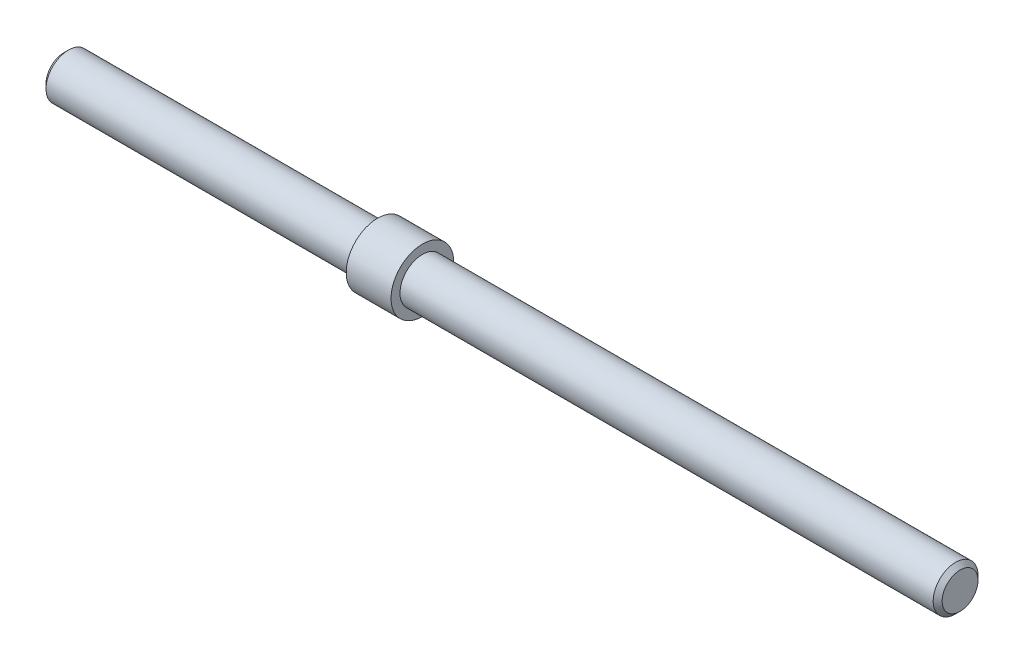
ISO-10303-21;
HEADER;
FILE_DESCRIPTION(('STEP AP214'),'2;1');
FILE_NAME('part.step','',(''),(''),'','','');
FILE_SCHEMA(('AUTOMOTIVE_DESIGN { 1 0 10303 214 1 1 1 1 }'));
ENDSEC;
DATA;
#1=APPLICATION_CONTEXT('core data for automotive mechanical design processes');
#2=APPLICATION_PROTOCOL_DEFINITION('international standard','automotive_design',2000,#1);
#3=PRODUCT_CONTEXT('',#1,'mechanical');
#4=PRODUCT('Part','Part','',(#3));
#5=PRODUCT_RELATED_PRODUCT_CATEGORY('part','',(#4));
#6=PRODUCT_DEFINITION_FORMATION('','',#4);
#7=PRODUCT_DEFINITION_CONTEXT('part definition',#1,'design');
#8=PRODUCT_DEFINITION('design','',#6,#7);
#9=PRODUCT_DEFINITION_SHAPE('','',#8);
#10=(LENGTH_UNIT() NAMED_UNIT(*) SI_UNIT(.MILLI.,.METRE.));
#11=(NAMED_UNIT(*) PLANE_ANGLE_UNIT() SI_UNIT($,.RADIAN.));
#12=(NAMED_UNIT(*) SI_UNIT($,.STERADIAN.) SOLID_ANGLE_UNIT());
#13=UNCERTAINTY_MEASURE_WITH_UNIT(LENGTH_MEASURE(1.E-05),#10,'distance_accuracy_value','');
#14=(GEOMETRIC_REPRESENTATION_CONTEXT(3) GLOBAL_UNCERTAINTY_ASSIGNED_CONTEXT((#13)) GLOBAL_UNIT_ASSIGNED_CONTEXT((#10,
#11,#12)) REPRESENTATION_CONTEXT('',''));
#15=CARTESIAN_POINT('',(0.,0.,0.));
#16=DIRECTION('',(0.,0.,1.));
#17=DIRECTION('',(1.,0.,0.));
#18=AXIS2_PLACEMENT_3D('',#15,#16,#17);
#19=CARTESIAN_POINT('',(200.,0.,0.));
#20=DIRECTION('',(-1.,0.,0.));
#21=DIRECTION('',(0.,0.,1.));
#22=AXIS2_PLACEMENT_3D('',#19,#20,#21);
#23=CYLINDRICAL_SURFACE('',#22,5.);
#24=CARTESIAN_POINT('',(80.,0.,0.));
#25=DIRECTION('',(1.,0.,0.));
#26=DIRECTION('',(0.,0.,-1.));
#27=AXIS2_PLACEMENT_3D('',#24,#25,#26);
#28=CIRCLE('',#27,5.);
#29=CARTESIAN_POINT('',(80.,0.,-5.));
#30=VERTEX_POINT('',#29);
#31=EDGE_CURVE('E42',#30,#30,#28,.T.);
#32=ORIENTED_EDGE('',*,*,#31,.T.);
#33=EDGE_LOOP('',(#32));
#34=FACE_BOUND('',#33,.T.);
#35=CARTESIAN_POINT('',(199.,0.,0.));
#36=DIRECTION('',(1.,0.,0.));
#37=DIRECTION('',(0.,0.,-1.));
#38=AXIS2_PLACEMENT_3D('',#35,#36,#37);
#39=CIRCLE('',#38,5.);
#40=CARTESIAN_POINT('',(199.,0.,-5.));
#41=VERTEX_POINT('',#40);
#42=EDGE_CURVE('E50',#41,#41,#39,.F.);
#43=ORIENTED_EDGE('',*,*,#42,.T.);
#44=EDGE_LOOP('',(#43));
#45=FACE_BOUND('',#44,.T.);
#46=ADVANCED_FACE('F37',(#34,#45),#23,.T.);
#47=CARTESIAN_POINT('',(200.,0.,0.));
#48=DIRECTION('',(1.,0.,0.));
#49=DIRECTION('',(0.,0.,-1.));
#50=AXIS2_PLACEMENT_3D('',#47,#48,#49);
#51=PLANE('',#50);
#52=CARTESIAN_POINT('',(200.,0.,0.));
#53=DIRECTION('',(1.,0.,0.));
#54=DIRECTION('',(0.,0.,-1.));
#55=AXIS2_PLACEMENT_3D('',#52,#53,#54);
#56=CIRCLE('',#55,4.);
#57=CARTESIAN_POINT('',(200.,0.,-4.));
#58=VERTEX_POINT('',#57);
#59=EDGE_CURVE('E58',#58,#58,#56,.T.);
#60=ORIENTED_EDGE('',*,*,#59,.T.);
#61=EDGE_LOOP('',(#60));
#62=FACE_BOUND('',#61,.T.);
#63=ADVANCED_FACE('F88',(#62),#51,.T.);
#64=CARTESIAN_POINT('',(200.,0.,0.));
#65=DIRECTION('',(-1.,0.,0.));
#66=DIRECTION('',(0.,0.,1.));
#67=AXIS2_PLACEMENT_3D('',#64,#65,#66);
#68=CONICAL_SURFACE('',#67,4.,0.78539816339746);
#69=ORIENTED_EDGE('',*,*,#42,.F.);
#70=EDGE_LOOP('',(#69));
#71=FACE_BOUND('',#70,.T.);
#72=ORIENTED_EDGE('',*,*,#59,.F.);
#73=EDGE_LOOP('',(#72));
#74=FACE_BOUND('',#73,.T.);
#75=ADVANCED_FACE('F84',(#71,#74),#68,.T.);
#76=CARTESIAN_POINT('',(80.,0.,0.));
#77=DIRECTION('',(-1.,0.,0.));
#78=DIRECTION('',(0.,0.,1.));
#79=AXIS2_PLACEMENT_3D('',#76,#77,#78);
#80=CYLINDRICAL_SURFACE('',#79,7.);
#81=CARTESIAN_POINT('',(80.,0.,0.));
#82=DIRECTION('',(1.,0.,0.));
#83=DIRECTION('',(0.,0.,-1.));
#84=AXIS2_PLACEMENT_3D('',#81,#82,#83);
#85=CIRCLE('',#84,7.);
#86=CARTESIAN_POINT('',(80.,0.,-7.));
#87=VERTEX_POINT('',#86);
#88=EDGE_CURVE('E64',#87,#87,#85,.T.);
#89=ORIENTED_EDGE('',*,*,#88,.F.);
#90=EDGE_LOOP('',(#89));
#91=FACE_BOUND('',#90,.T.);
#92=CARTESIAN_POINT('',(70.,0.,0.));
#93=DIRECTION('',(1.,0.,0.));
#94=DIRECTION('',(0.,0.,-1.));
#95=AXIS2_PLACEMENT_3D('',#92,#93,#94);
#96=CIRCLE('',#95,7.);
#97=CARTESIAN_POINT('',(70.,0.,-7.));
#98=VERTEX_POINT('',#97);
#99=EDGE_CURVE('E61',#98,#98,#96,.T.);
#100=ORIENTED_EDGE('',*,*,#99,.T.);
#101=EDGE_LOOP('',(#100));
#102=FACE_BOUND('',#101,.T.);
#103=ADVANCED_FACE('F76',(#91,#102),#80,.T.);
#104=CARTESIAN_POINT('',(80.,0.,0.));
#105=DIRECTION('',(1.,0.,0.));
#106=DIRECTION('',(0.,0.,-1.));
#107=AXIS2_PLACEMENT_3D('',#104,#105,#106);
#108=PLANE('',#107);
#109=ORIENTED_EDGE('',*,*,#31,.F.);
#110=EDGE_LOOP('',(#109));
#111=FACE_BOUND('',#110,.T.);
#112=ORIENTED_EDGE('',*,*,#88,.T.);
#113=EDGE_LOOP('',(#112));
#114=FACE_BOUND('',#113,.T.);
#115=ADVANCED_FACE('F73',(#111,#114),#108,.T.);
#116=CARTESIAN_POINT('',(70.,0.,0.));
#117=DIRECTION('',(1.,0.,0.));
#118=DIRECTION('',(0.,0.,-1.));
#119=AXIS2_PLACEMENT_3D('',#116,#117,#118);
#120=PLANE('',#119);
#121=CARTESIAN_POINT('',(70.,0.,0.));
#122=DIRECTION('',(1.,0.,0.));
#123=DIRECTION('',(0.,0.,-1.));
#124=AXIS2_PLACEMENT_3D('',#121,#122,#123);
#125=CIRCLE('',#124,5.);
#126=CARTESIAN_POINT('',(70.,0.,-5.));
#127=VERTEX_POINT('',#126);
#128=EDGE_CURVE('E10',#127,#127,#125,.T.);
#129=ORIENTED_EDGE('',*,*,#128,.T.);
#130=EDGE_LOOP('',(#129));
#131=FACE_BOUND('',#130,.T.);
#132=ORIENTED_EDGE('',*,*,#99,.F.);
#133=EDGE_LOOP('',(#132));
#134=FACE_BOUND('',#133,.T.);
#135=ADVANCED_FACE('F75',(#131,#134),#120,.F.);
#136=CARTESIAN_POINT('',(0.,0.,0.));
#137=DIRECTION('',(1.,0.,0.));
#138=DIRECTION('',(0.,0.,-1.));
#139=AXIS2_PLACEMENT_3D('',#136,#137,#138);
#140=PLANE('',#139);
#141=CARTESIAN_POINT('',(0.,0.,0.));
#142=DIRECTION('',(1.,0.,0.));
#143=DIRECTION('',(0.,0.,-1.));
#144=AXIS2_PLACEMENT_3D('',#141,#142,#143);
#145=CIRCLE('',#144,4.00000000000003);
#146=CARTESIAN_POINT('',(0.,0.,-4.00000000000003));
#147=VERTEX_POINT('',#146);
#148=EDGE_CURVE('E46',#147,#147,#145,.F.);
#149=ORIENTED_EDGE('',*,*,#148,.T.);
#150=EDGE_LOOP('',(#149));
#151=FACE_BOUND('',#150,.T.);
#152=ADVANCED_FACE('F82',(#151),#140,.F.);
#153=CARTESIAN_POINT('',(0.999999999999945,0.,0.));
#154=DIRECTION('',(1.,0.,0.));
#155=DIRECTION('',(0.,0.,-1.));
#156=AXIS2_PLACEMENT_3D('',#153,#154,#155);
#157=CONICAL_SURFACE('',#156,5.,0.78539816339746);
#158=ORIENTED_EDGE('',*,*,#148,.F.);
#159=EDGE_LOOP('',(#158));
#160=FACE_BOUND('',#159,.T.);
#161=CARTESIAN_POINT('',(0.999999999999945,0.,0.));
#162=DIRECTION('',(1.,0.,0.));
#163=DIRECTION('',(0.,0.,-1.));
#164=AXIS2_PLACEMENT_3D('',#161,#162,#163);
#165=CIRCLE('',#164,5.);
#166=CARTESIAN_POINT('',(0.999999999999945,0.,-5.));
#167=VERTEX_POINT('',#166);
#168=EDGE_CURVE('E55',#167,#167,#165,.T.);
#169=ORIENTED_EDGE('',*,*,#168,.F.);
#170=EDGE_LOOP('',(#169));
#171=FACE_BOUND('',#170,.T.);
#172=ADVANCED_FACE('F40',(#160,#171),#157,.T.);
#173=ORIENTED_EDGE('',*,*,#168,.T.);
#174=EDGE_LOOP('',(#173));
#175=FACE_BOUND('',#174,.T.);
#176=ORIENTED_EDGE('',*,*,#128,.F.);
#177=EDGE_LOOP('',(#176));
#178=FACE_BOUND('',#177,.T.);
#179=ADVANCED_FACE('F90',(#175,#178),#23,.T.);
#180=CLOSED_SHELL('',(#46,#63,#75,#103,#115,#135,#152,#172,#179));
#181=MANIFOLD_SOLID_BREP('B2',#180);
#182=ADVANCED_BREP_SHAPE_REPRESENTATION('',(#18,#181),#14);
#183=SHAPE_DEFINITION_REPRESENTATION(#9,#182);
ENDSEC;
END-ISO-10303-21;
